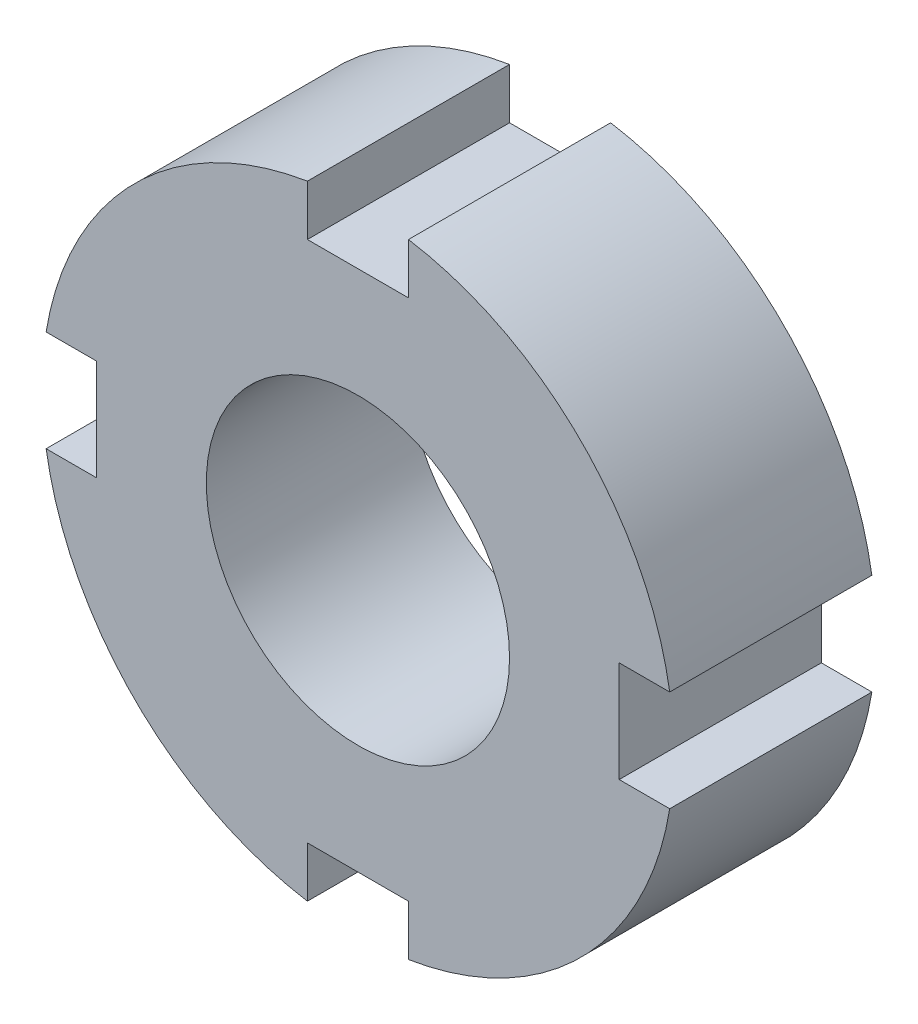
ISO-10303-21;
HEADER;
FILE_DESCRIPTION(('STEP AP214'),'2;1');
FILE_NAME('part.step','',(''),(''),'','','');
FILE_SCHEMA(('AUTOMOTIVE_DESIGN { 1 0 10303 214 1 1 1 1 }'));
ENDSEC;
DATA;
#1=APPLICATION_CONTEXT('core data for automotive mechanical design processes');
#2=APPLICATION_PROTOCOL_DEFINITION('international standard','automotive_design',2000,#1);
#3=PRODUCT_CONTEXT('',#1,'mechanical');
#4=PRODUCT('Part','Part','',(#3));
#5=PRODUCT_RELATED_PRODUCT_CATEGORY('part','',(#4));
#6=PRODUCT_DEFINITION_FORMATION('','',#4);
#7=PRODUCT_DEFINITION_CONTEXT('part definition',#1,'design');
#8=PRODUCT_DEFINITION('design','',#6,#7);
#9=PRODUCT_DEFINITION_SHAPE('','',#8);
#10=(LENGTH_UNIT() NAMED_UNIT(*) SI_UNIT(.MILLI.,.METRE.));
#11=(NAMED_UNIT(*) PLANE_ANGLE_UNIT() SI_UNIT($,.RADIAN.));
#12=(NAMED_UNIT(*) SI_UNIT($,.STERADIAN.) SOLID_ANGLE_UNIT());
#13=UNCERTAINTY_MEASURE_WITH_UNIT(LENGTH_MEASURE(1.E-05),#10,'distance_accuracy_value','');
#14=(GEOMETRIC_REPRESENTATION_CONTEXT(3) GLOBAL_UNCERTAINTY_ASSIGNED_CONTEXT((#13)) GLOBAL_UNIT_ASSIGNED_CONTEXT((#10,
#11,#12)) REPRESENTATION_CONTEXT('',''));
#15=CARTESIAN_POINT('',(0.,0.,0.));
#16=DIRECTION('',(0.,0.,1.));
#17=DIRECTION('',(1.,0.,0.));
#18=AXIS2_PLACEMENT_3D('',#15,#16,#17);
#19=CARTESIAN_POINT('',(0.,2.,8.));
#20=DIRECTION('',(0.,1.,0.));
#21=DIRECTION('',(0.,0.,1.));
#22=AXIS2_PLACEMENT_3D('',#19,#20,#21);
#23=PLANE('',#22);
#24=DIRECTION('',(1.,0.,0.));
#25=VECTOR('',#24,1.);
#26=CARTESIAN_POINT('',(0.,2.,0.));
#27=LINE('',#26,#25);
#28=CARTESIAN_POINT('',(10.3389626792531,2.,0.));
#29=VERTEX_POINT('',#28);
#30=CARTESIAN_POINT('',(12.3389626792531,2.,0.));
#31=VERTEX_POINT('',#30);
#32=EDGE_CURVE('E190',#29,#31,#27,.T.);
#33=ORIENTED_EDGE('',*,*,#32,.T.);
#34=DIRECTION('',(0.,0.,-1.));
#35=VECTOR('',#34,1.);
#36=CARTESIAN_POINT('',(12.3389626792531,2.,8.));
#37=LINE('',#36,#35);
#38=CARTESIAN_POINT('',(12.3389626792531,2.,8.));
#39=VERTEX_POINT('',#38);
#40=EDGE_CURVE('E11',#39,#31,#37,.T.);
#41=ORIENTED_EDGE('',*,*,#40,.F.);
#42=DIRECTION('',(1.,0.,0.));
#43=VECTOR('',#42,1.);
#44=CARTESIAN_POINT('',(0.,2.,8.));
#45=LINE('',#44,#43);
#46=CARTESIAN_POINT('',(10.3389626792531,2.,8.));
#47=VERTEX_POINT('',#46);
#48=EDGE_CURVE('E273',#47,#39,#45,.T.);
#49=ORIENTED_EDGE('',*,*,#48,.F.);
#50=DIRECTION('',(0.,0.,-1.));
#51=VECTOR('',#50,1.);
#52=CARTESIAN_POINT('',(10.3389626792531,2.,8.));
#53=LINE('',#52,#51);
#54=EDGE_CURVE('E56',#47,#29,#53,.T.);
#55=ORIENTED_EDGE('',*,*,#54,.T.);
#56=EDGE_LOOP('',(#33,#41,#49,#55));
#57=FACE_BOUND('',#56,.T.);
#58=ADVANCED_FACE('F39',(#57),#23,.F.);
#59=CARTESIAN_POINT('',(0.,0.,8.));
#60=DIRECTION('',(0.,0.,-1.));
#61=DIRECTION('',(-1.,0.,0.));
#62=AXIS2_PLACEMENT_3D('',#59,#60,#61);
#63=CYLINDRICAL_SURFACE('',#62,12.5);
#64=CARTESIAN_POINT('',(0.,0.,0.));
#65=DIRECTION('',(0.,0.,1.));
#66=DIRECTION('',(1.,0.,0.));
#67=AXIS2_PLACEMENT_3D('',#64,#65,#66);
#68=CIRCLE('',#67,12.5);
#69=CARTESIAN_POINT('',(2.,12.3389626792531,0.));
#70=VERTEX_POINT('',#69);
#71=EDGE_CURVE('E192',#31,#70,#68,.T.);
#72=ORIENTED_EDGE('',*,*,#71,.T.);
#73=DIRECTION('',(0.,0.,-1.));
#74=VECTOR('',#73,1.);
#75=CARTESIAN_POINT('',(2.,12.3389626792531,8.));
#76=LINE('',#75,#74);
#77=CARTESIAN_POINT('',(2.,12.3389626792531,8.));
#78=VERTEX_POINT('',#77);
#79=EDGE_CURVE('E48',#78,#70,#76,.T.);
#80=ORIENTED_EDGE('',*,*,#79,.F.);
#81=CARTESIAN_POINT('',(0.,0.,8.));
#82=DIRECTION('',(0.,0.,1.));
#83=DIRECTION('',(1.,0.,0.));
#84=AXIS2_PLACEMENT_3D('',#81,#82,#83);
#85=CIRCLE('',#84,12.5);
#86=EDGE_CURVE('E118',#39,#78,#85,.T.);
#87=ORIENTED_EDGE('',*,*,#86,.F.);
#88=ORIENTED_EDGE('',*,*,#40,.T.);
#89=EDGE_LOOP('',(#72,#80,#87,#88));
#90=FACE_BOUND('',#89,.T.);
#91=ADVANCED_FACE('F257',(#90),#63,.T.);
#92=CARTESIAN_POINT('',(2.,0.,8.));
#93=DIRECTION('',(-1.,0.,0.));
#94=DIRECTION('',(0.,-1.,0.));
#95=AXIS2_PLACEMENT_3D('',#92,#93,#94);
#96=PLANE('',#95);
#97=DIRECTION('',(0.,1.,0.));
#98=VECTOR('',#97,1.);
#99=CARTESIAN_POINT('',(2.,0.,0.));
#100=LINE('',#99,#98);
#101=CARTESIAN_POINT('',(2.,10.3389626792531,0.));
#102=VERTEX_POINT('',#101);
#103=EDGE_CURVE('E195',#102,#70,#100,.T.);
#104=ORIENTED_EDGE('',*,*,#103,.F.);
#105=DIRECTION('',(0.,0.,-1.));
#106=VECTOR('',#105,1.);
#107=CARTESIAN_POINT('',(2.,10.3389626792531,8.));
#108=LINE('',#107,#106);
#109=CARTESIAN_POINT('',(2.,10.3389626792531,8.));
#110=VERTEX_POINT('',#109);
#111=EDGE_CURVE('E250',#110,#102,#108,.T.);
#112=ORIENTED_EDGE('',*,*,#111,.F.);
#113=DIRECTION('',(0.,1.,0.));
#114=VECTOR('',#113,1.);
#115=CARTESIAN_POINT('',(2.,0.,8.));
#116=LINE('',#115,#114);
#117=EDGE_CURVE('E256',#110,#78,#116,.T.);
#118=ORIENTED_EDGE('',*,*,#117,.T.);
#119=ORIENTED_EDGE('',*,*,#79,.T.);
#120=EDGE_LOOP('',(#104,#112,#118,#119));
#121=FACE_BOUND('',#120,.T.);
#122=ADVANCED_FACE('F254',(#121),#96,.T.);
#123=CARTESIAN_POINT('',(0.,10.3389626792531,8.));
#124=DIRECTION('',(0.,1.,0.));
#125=DIRECTION('',(0.,0.,1.));
#126=AXIS2_PLACEMENT_3D('',#123,#124,#125);
#127=PLANE('',#126);
#128=DIRECTION('',(1.,0.,0.));
#129=VECTOR('',#128,1.);
#130=CARTESIAN_POINT('',(0.,10.3389626792531,0.));
#131=LINE('',#130,#129);
#132=CARTESIAN_POINT('',(-2.,10.3389626792531,0.));
#133=VERTEX_POINT('',#132);
#134=EDGE_CURVE('E199',#133,#102,#131,.T.);
#135=ORIENTED_EDGE('',*,*,#134,.F.);
#136=DIRECTION('',(0.,0.,-1.));
#137=VECTOR('',#136,1.);
#138=CARTESIAN_POINT('',(-2.,10.3389626792531,8.));
#139=LINE('',#138,#137);
#140=CARTESIAN_POINT('',(-2.,10.3389626792531,8.));
#141=VERTEX_POINT('',#140);
#142=EDGE_CURVE('E248',#141,#133,#139,.T.);
#143=ORIENTED_EDGE('',*,*,#142,.F.);
#144=DIRECTION('',(1.,0.,0.));
#145=VECTOR('',#144,1.);
#146=CARTESIAN_POINT('',(0.,10.3389626792531,8.));
#147=LINE('',#146,#145);
#148=EDGE_CURVE('E269',#141,#110,#147,.T.);
#149=ORIENTED_EDGE('',*,*,#148,.T.);
#150=ORIENTED_EDGE('',*,*,#111,.T.);
#151=EDGE_LOOP('',(#135,#143,#149,#150));
#152=FACE_BOUND('',#151,.T.);
#153=ADVANCED_FACE('F265',(#152),#127,.T.);
#154=CARTESIAN_POINT('',(-2.,0.,8.));
#155=DIRECTION('',(-1.,0.,0.));
#156=DIRECTION('',(0.,0.,1.));
#157=AXIS2_PLACEMENT_3D('',#154,#155,#156);
#158=PLANE('',#157);
#159=DIRECTION('',(0.,1.,0.));
#160=VECTOR('',#159,1.);
#161=CARTESIAN_POINT('',(-2.,0.,0.));
#162=LINE('',#161,#160);
#163=CARTESIAN_POINT('',(-2.,12.3389626792531,0.));
#164=VERTEX_POINT('',#163);
#165=EDGE_CURVE('E202',#133,#164,#162,.T.);
#166=ORIENTED_EDGE('',*,*,#165,.T.);
#167=DIRECTION('',(0.,0.,-1.));
#168=VECTOR('',#167,1.);
#169=CARTESIAN_POINT('',(-2.,12.3389626792531,8.));
#170=LINE('',#169,#168);
#171=CARTESIAN_POINT('',(-2.,12.3389626792531,8.));
#172=VERTEX_POINT('',#171);
#173=EDGE_CURVE('E245',#172,#164,#170,.T.);
#174=ORIENTED_EDGE('',*,*,#173,.F.);
#175=DIRECTION('',(0.,1.,0.));
#176=VECTOR('',#175,1.);
#177=CARTESIAN_POINT('',(-2.,0.,8.));
#178=LINE('',#177,#176);
#179=EDGE_CURVE('E271',#141,#172,#178,.T.);
#180=ORIENTED_EDGE('',*,*,#179,.F.);
#181=ORIENTED_EDGE('',*,*,#142,.T.);
#182=EDGE_LOOP('',(#166,#174,#180,#181));
#183=FACE_BOUND('',#182,.T.);
#184=ADVANCED_FACE('F344',(#183),#158,.F.);
#185=CARTESIAN_POINT('',(-12.3389626792531,2.00000000000001,0.));
#186=VERTEX_POINT('',#185);
#187=EDGE_CURVE('E196',#164,#186,#68,.T.);
#188=ORIENTED_EDGE('',*,*,#187,.T.);
#189=DIRECTION('',(0.,0.,-1.));
#190=VECTOR('',#189,1.);
#191=CARTESIAN_POINT('',(-12.3389626792531,2.00000000000001,8.));
#192=LINE('',#191,#190);
#193=CARTESIAN_POINT('',(-12.3389626792531,2.00000000000001,8.));
#194=VERTEX_POINT('',#193);
#195=EDGE_CURVE('E243',#194,#186,#192,.T.);
#196=ORIENTED_EDGE('',*,*,#195,.F.);
#197=EDGE_CURVE('E274',#172,#194,#85,.T.);
#198=ORIENTED_EDGE('',*,*,#197,.F.);
#199=ORIENTED_EDGE('',*,*,#173,.T.);
#200=EDGE_LOOP('',(#188,#196,#198,#199));
#201=FACE_BOUND('',#200,.T.);
#202=ADVANCED_FACE('F304',(#201),#63,.T.);
#203=CARTESIAN_POINT('',(0.,2.00000000000001,8.));
#204=DIRECTION('',(0.,-1.,0.));
#205=DIRECTION('',(0.,0.,-1.));
#206=AXIS2_PLACEMENT_3D('',#203,#204,#205);
#207=PLANE('',#206);
#208=DIRECTION('',(-1.,0.,0.));
#209=VECTOR('',#208,1.);
#210=CARTESIAN_POINT('',(0.,2.00000000000001,0.));
#211=LINE('',#210,#209);
#212=CARTESIAN_POINT('',(-10.3389626792531,2.00000000000001,0.));
#213=VERTEX_POINT('',#212);
#214=EDGE_CURVE('E204',#213,#186,#211,.T.);
#215=ORIENTED_EDGE('',*,*,#214,.F.);
#216=DIRECTION('',(0.,0.,-1.));
#217=VECTOR('',#216,1.);
#218=CARTESIAN_POINT('',(-10.3389626792531,2.00000000000001,8.));
#219=LINE('',#218,#217);
#220=CARTESIAN_POINT('',(-10.3389626792531,2.00000000000001,8.));
#221=VERTEX_POINT('',#220);
#222=EDGE_CURVE('E241',#221,#213,#219,.T.);
#223=ORIENTED_EDGE('',*,*,#222,.F.);
#224=DIRECTION('',(-1.,0.,0.));
#225=VECTOR('',#224,1.);
#226=CARTESIAN_POINT('',(0.,2.00000000000001,8.));
#227=LINE('',#226,#225);
#228=EDGE_CURVE('E278',#221,#194,#227,.T.);
#229=ORIENTED_EDGE('',*,*,#228,.T.);
#230=ORIENTED_EDGE('',*,*,#195,.T.);
#231=EDGE_LOOP('',(#215,#223,#229,#230));
#232=FACE_BOUND('',#231,.T.);
#233=ADVANCED_FACE('F311',(#232),#207,.T.);
#234=CARTESIAN_POINT('',(-10.3389626792531,0.,8.));
#235=DIRECTION('',(1.,0.,0.));
#236=DIRECTION('',(0.,0.,-1.));
#237=AXIS2_PLACEMENT_3D('',#234,#235,#236);
#238=PLANE('',#237);
#239=DIRECTION('',(0.,-1.,0.));
#240=VECTOR('',#239,1.);
#241=CARTESIAN_POINT('',(-10.3389626792531,0.,0.));
#242=LINE('',#241,#240);
#243=CARTESIAN_POINT('',(-10.3389626792531,-1.99999999999999,0.));
#244=VERTEX_POINT('',#243);
#245=EDGE_CURVE('E207',#213,#244,#242,.T.);
#246=ORIENTED_EDGE('',*,*,#245,.T.);
#247=DIRECTION('',(0.,0.,-1.));
#248=VECTOR('',#247,1.);
#249=CARTESIAN_POINT('',(-10.3389626792531,-1.99999999999999,8.));
#250=LINE('',#249,#248);
#251=CARTESIAN_POINT('',(-10.3389626792531,-1.99999999999999,8.));
#252=VERTEX_POINT('',#251);
#253=EDGE_CURVE('E238',#252,#244,#250,.T.);
#254=ORIENTED_EDGE('',*,*,#253,.F.);
#255=DIRECTION('',(0.,-1.,0.));
#256=VECTOR('',#255,1.);
#257=CARTESIAN_POINT('',(-10.3389626792531,0.,8.));
#258=LINE('',#257,#256);
#259=EDGE_CURVE('E281',#221,#252,#258,.T.);
#260=ORIENTED_EDGE('',*,*,#259,.F.);
#261=ORIENTED_EDGE('',*,*,#222,.T.);
#262=EDGE_LOOP('',(#246,#254,#260,#261));
#263=FACE_BOUND('',#262,.T.);
#264=ADVANCED_FACE('F325',(#263),#238,.F.);
#265=CARTESIAN_POINT('',(0.,-1.99999999999999,8.));
#266=DIRECTION('',(0.,-1.,0.));
#267=DIRECTION('',(0.,0.,-1.));
#268=AXIS2_PLACEMENT_3D('',#265,#266,#267);
#269=PLANE('',#268);
#270=DIRECTION('',(-1.,0.,0.));
#271=VECTOR('',#270,1.);
#272=CARTESIAN_POINT('',(0.,-1.99999999999999,0.));
#273=LINE('',#272,#271);
#274=CARTESIAN_POINT('',(-12.3389626792531,-1.99999999999999,0.));
#275=VERTEX_POINT('',#274);
#276=EDGE_CURVE('E209',#244,#275,#273,.T.);
#277=ORIENTED_EDGE('',*,*,#276,.T.);
#278=DIRECTION('',(0.,0.,-1.));
#279=VECTOR('',#278,1.);
#280=CARTESIAN_POINT('',(-12.3389626792531,-1.99999999999999,8.));
#281=LINE('',#280,#279);
#282=CARTESIAN_POINT('',(-12.3389626792531,-1.99999999999999,8.));
#283=VERTEX_POINT('',#282);
#284=EDGE_CURVE('E235',#283,#275,#281,.T.);
#285=ORIENTED_EDGE('',*,*,#284,.F.);
#286=DIRECTION('',(-1.,0.,0.));
#287=VECTOR('',#286,1.);
#288=CARTESIAN_POINT('',(0.,-1.99999999999999,8.));
#289=LINE('',#288,#287);
#290=EDGE_CURVE('E283',#252,#283,#289,.T.);
#291=ORIENTED_EDGE('',*,*,#290,.F.);
#292=ORIENTED_EDGE('',*,*,#253,.T.);
#293=EDGE_LOOP('',(#277,#285,#291,#292));
#294=FACE_BOUND('',#293,.T.);
#295=ADVANCED_FACE('F323',(#294),#269,.F.);
#296=CARTESIAN_POINT('',(-2.,-12.3389626792531,0.));
#297=VERTEX_POINT('',#296);
#298=EDGE_CURVE('E211',#275,#297,#68,.T.);
#299=ORIENTED_EDGE('',*,*,#298,.T.);
#300=DIRECTION('',(0.,0.,-1.));
#301=VECTOR('',#300,1.);
#302=CARTESIAN_POINT('',(-2.,-12.3389626792531,8.));
#303=LINE('',#302,#301);
#304=CARTESIAN_POINT('',(-2.,-12.3389626792531,8.));
#305=VERTEX_POINT('',#304);
#306=EDGE_CURVE('E233',#305,#297,#303,.T.);
#307=ORIENTED_EDGE('',*,*,#306,.F.);
#308=EDGE_CURVE('E170',#283,#305,#85,.T.);
#309=ORIENTED_EDGE('',*,*,#308,.F.);
#310=ORIENTED_EDGE('',*,*,#284,.T.);
#311=EDGE_LOOP('',(#299,#307,#309,#310));
#312=FACE_BOUND('',#311,.T.);
#313=ADVANCED_FACE('F318',(#312),#63,.T.);
#314=CARTESIAN_POINT('',(-2.,0.,8.));
#315=DIRECTION('',(1.,0.,0.));
#316=DIRECTION('',(0.,0.,-1.));
#317=AXIS2_PLACEMENT_3D('',#314,#315,#316);
#318=PLANE('',#317);
#319=DIRECTION('',(0.,-1.,0.));
#320=VECTOR('',#319,1.);
#321=CARTESIAN_POINT('',(-2.,0.,0.));
#322=LINE('',#321,#320);
#323=CARTESIAN_POINT('',(-2.,-10.3389626792531,0.));
#324=VERTEX_POINT('',#323);
#325=EDGE_CURVE('E212',#324,#297,#322,.T.);
#326=ORIENTED_EDGE('',*,*,#325,.F.);
#327=DIRECTION('',(0.,0.,-1.));
#328=VECTOR('',#327,1.);
#329=CARTESIAN_POINT('',(-2.,-10.3389626792531,8.));
#330=LINE('',#329,#328);
#331=CARTESIAN_POINT('',(-2.,-10.3389626792531,8.));
#332=VERTEX_POINT('',#331);
#333=EDGE_CURVE('E231',#332,#324,#330,.T.);
#334=ORIENTED_EDGE('',*,*,#333,.F.);
#335=DIRECTION('',(0.,-1.,0.));
#336=VECTOR('',#335,1.);
#337=CARTESIAN_POINT('',(-2.,0.,8.));
#338=LINE('',#337,#336);
#339=EDGE_CURVE('E285',#332,#305,#338,.T.);
#340=ORIENTED_EDGE('',*,*,#339,.T.);
#341=ORIENTED_EDGE('',*,*,#306,.T.);
#342=EDGE_LOOP('',(#326,#334,#340,#341));
#343=FACE_BOUND('',#342,.T.);
#344=ADVANCED_FACE('F321',(#343),#318,.T.);
#345=CARTESIAN_POINT('',(0.,-10.3389626792531,8.));
#346=DIRECTION('',(0.,1.,0.));
#347=DIRECTION('',(0.,0.,1.));
#348=AXIS2_PLACEMENT_3D('',#345,#346,#347);
#349=PLANE('',#348);
#350=DIRECTION('',(1.,0.,0.));
#351=VECTOR('',#350,1.);
#352=CARTESIAN_POINT('',(0.,-10.3389626792531,0.));
#353=LINE('',#352,#351);
#354=CARTESIAN_POINT('',(2.,-10.3389626792531,0.));
#355=VERTEX_POINT('',#354);
#356=EDGE_CURVE('E215',#324,#355,#353,.T.);
#357=ORIENTED_EDGE('',*,*,#356,.T.);
#358=DIRECTION('',(0.,0.,-1.));
#359=VECTOR('',#358,1.);
#360=CARTESIAN_POINT('',(2.,-10.3389626792531,8.));
#361=LINE('',#360,#359);
#362=CARTESIAN_POINT('',(2.,-10.3389626792531,8.));
#363=VERTEX_POINT('',#362);
#364=EDGE_CURVE('E228',#363,#355,#361,.T.);
#365=ORIENTED_EDGE('',*,*,#364,.F.);
#366=DIRECTION('',(1.,0.,0.));
#367=VECTOR('',#366,1.);
#368=CARTESIAN_POINT('',(0.,-10.3389626792531,8.));
#369=LINE('',#368,#367);
#370=EDGE_CURVE('E287',#332,#363,#369,.T.);
#371=ORIENTED_EDGE('',*,*,#370,.F.);
#372=ORIENTED_EDGE('',*,*,#333,.T.);
#373=EDGE_LOOP('',(#357,#365,#371,#372));
#374=FACE_BOUND('',#373,.T.);
#375=ADVANCED_FACE('F292',(#374),#349,.F.);
#376=CARTESIAN_POINT('',(2.,0.,8.));
#377=DIRECTION('',(1.,0.,0.));
#378=DIRECTION('',(0.,1.,0.));
#379=AXIS2_PLACEMENT_3D('',#376,#377,#378);
#380=PLANE('',#379);
#381=DIRECTION('',(0.,-1.,0.));
#382=VECTOR('',#381,1.);
#383=CARTESIAN_POINT('',(2.,0.,0.));
#384=LINE('',#383,#382);
#385=CARTESIAN_POINT('',(2.,-12.3389626792531,0.));
#386=VERTEX_POINT('',#385);
#387=EDGE_CURVE('E217',#355,#386,#384,.T.);
#388=ORIENTED_EDGE('',*,*,#387,.T.);
#389=DIRECTION('',(0.,0.,-1.));
#390=VECTOR('',#389,1.);
#391=CARTESIAN_POINT('',(2.,-12.3389626792531,8.));
#392=LINE('',#391,#390);
#393=CARTESIAN_POINT('',(2.,-12.3389626792531,8.));
#394=VERTEX_POINT('',#393);
#395=EDGE_CURVE('E178',#394,#386,#392,.T.);
#396=ORIENTED_EDGE('',*,*,#395,.F.);
#397=DIRECTION('',(0.,-1.,0.));
#398=VECTOR('',#397,1.);
#399=CARTESIAN_POINT('',(2.,0.,8.));
#400=LINE('',#399,#398);
#401=EDGE_CURVE('E165',#363,#394,#400,.T.);
#402=ORIENTED_EDGE('',*,*,#401,.F.);
#403=ORIENTED_EDGE('',*,*,#364,.T.);
#404=EDGE_LOOP('',(#388,#396,#402,#403));
#405=FACE_BOUND('',#404,.T.);
#406=ADVANCED_FACE('F296',(#405),#380,.F.);
#407=CARTESIAN_POINT('',(12.3389626792531,-2.,0.));
#408=VERTEX_POINT('',#407);
#409=EDGE_CURVE('E175',#386,#408,#68,.T.);
#410=ORIENTED_EDGE('',*,*,#409,.T.);
#411=DIRECTION('',(0.,0.,-1.));
#412=VECTOR('',#411,1.);
#413=CARTESIAN_POINT('',(12.3389626792531,-2.,8.));
#414=LINE('',#413,#412);
#415=CARTESIAN_POINT('',(12.3389626792531,-2.,8.));
#416=VERTEX_POINT('',#415);
#417=EDGE_CURVE('E172',#416,#408,#414,.T.);
#418=ORIENTED_EDGE('',*,*,#417,.F.);
#419=EDGE_CURVE('E158',#394,#416,#85,.T.);
#420=ORIENTED_EDGE('',*,*,#419,.F.);
#421=ORIENTED_EDGE('',*,*,#395,.T.);
#422=EDGE_LOOP('',(#410,#418,#420,#421));
#423=FACE_BOUND('',#422,.T.);
#424=ADVANCED_FACE('F173',(#423),#63,.T.);
#425=CARTESIAN_POINT('',(0.,-2.,8.));
#426=DIRECTION('',(0.,1.,0.));
#427=DIRECTION('',(0.,0.,1.));
#428=AXIS2_PLACEMENT_3D('',#425,#426,#427);
#429=PLANE('',#428);
#430=DIRECTION('',(1.,0.,0.));
#431=VECTOR('',#430,1.);
#432=CARTESIAN_POINT('',(0.,-2.,0.));
#433=LINE('',#432,#431);
#434=CARTESIAN_POINT('',(10.3389626792531,-2.,0.));
#435=VERTEX_POINT('',#434);
#436=EDGE_CURVE('E219',#435,#408,#433,.T.);
#437=ORIENTED_EDGE('',*,*,#436,.F.);
#438=DIRECTION('',(0.,0.,-1.));
#439=VECTOR('',#438,1.);
#440=CARTESIAN_POINT('',(10.3389626792531,-2.,8.));
#441=LINE('',#440,#439);
#442=CARTESIAN_POINT('',(10.3389626792531,-2.,8.));
#443=VERTEX_POINT('',#442);
#444=EDGE_CURVE('E106',#443,#435,#441,.T.);
#445=ORIENTED_EDGE('',*,*,#444,.F.);
#446=DIRECTION('',(1.,0.,0.));
#447=VECTOR('',#446,1.);
#448=CARTESIAN_POINT('',(0.,-2.,8.));
#449=LINE('',#448,#447);
#450=EDGE_CURVE('E163',#443,#416,#449,.T.);
#451=ORIENTED_EDGE('',*,*,#450,.T.);
#452=ORIENTED_EDGE('',*,*,#417,.T.);
#453=EDGE_LOOP('',(#437,#445,#451,#452));
#454=FACE_BOUND('',#453,.T.);
#455=ADVANCED_FACE('F180',(#454),#429,.T.);
#456=CARTESIAN_POINT('',(0.,0.,8.));
#457=DIRECTION('',(0.,0.,-1.));
#458=DIRECTION('',(-1.,0.,0.));
#459=AXIS2_PLACEMENT_3D('',#456,#457,#458);
#460=CYLINDRICAL_SURFACE('',#459,6.);
#461=CARTESIAN_POINT('',(0.,0.,8.));
#462=DIRECTION('',(0.,0.,1.));
#463=DIRECTION('',(1.,0.,0.));
#464=AXIS2_PLACEMENT_3D('',#461,#462,#463);
#465=CIRCLE('',#464,6.);
#466=CARTESIAN_POINT('',(6.,0.,8.));
#467=VERTEX_POINT('',#466);
#468=EDGE_CURVE('E224',#467,#467,#465,.T.);
#469=ORIENTED_EDGE('',*,*,#468,.T.);
#470=EDGE_LOOP('',(#469));
#471=FACE_BOUND('',#470,.T.);
#472=CARTESIAN_POINT('',(0.,0.,0.));
#473=DIRECTION('',(0.,0.,1.));
#474=DIRECTION('',(1.,0.,0.));
#475=AXIS2_PLACEMENT_3D('',#472,#473,#474);
#476=CIRCLE('',#475,6.);
#477=CARTESIAN_POINT('',(6.,0.,0.));
#478=VERTEX_POINT('',#477);
#479=EDGE_CURVE('E187',#478,#478,#476,.T.);
#480=ORIENTED_EDGE('',*,*,#479,.F.);
#481=EDGE_LOOP('',(#480));
#482=FACE_BOUND('',#481,.T.);
#483=ADVANCED_FACE('F41',(#471,#482),#460,.F.);
#484=CARTESIAN_POINT('',(10.3389626792531,0.,8.));
#485=DIRECTION('',(1.,0.,0.));
#486=DIRECTION('',(0.,0.,-1.));
#487=AXIS2_PLACEMENT_3D('',#484,#485,#486);
#488=PLANE('',#487);
#489=DIRECTION('',(0.,-1.,0.));
#490=VECTOR('',#489,1.);
#491=CARTESIAN_POINT('',(10.3389626792531,0.,0.));
#492=LINE('',#491,#490);
#493=EDGE_CURVE('E221',#29,#435,#492,.T.);
#494=ORIENTED_EDGE('',*,*,#493,.F.);
#495=ORIENTED_EDGE('',*,*,#54,.F.);
#496=DIRECTION('',(0.,-1.,0.));
#497=VECTOR('',#496,1.);
#498=CARTESIAN_POINT('',(10.3389626792531,0.,8.));
#499=LINE('',#498,#497);
#500=EDGE_CURVE('E181',#47,#443,#499,.T.);
#501=ORIENTED_EDGE('',*,*,#500,.T.);
#502=ORIENTED_EDGE('',*,*,#444,.T.);
#503=EDGE_LOOP('',(#494,#495,#501,#502));
#504=FACE_BOUND('',#503,.T.);
#505=ADVANCED_FACE('F449',(#504),#488,.T.);
#506=CARTESIAN_POINT('',(0.,0.,8.));
#507=DIRECTION('',(0.,0.,1.));
#508=DIRECTION('',(1.,0.,0.));
#509=AXIS2_PLACEMENT_3D('',#506,#507,#508);
#510=PLANE('',#509);
#511=ORIENTED_EDGE('',*,*,#468,.F.);
#512=EDGE_LOOP('',(#511));
#513=FACE_BOUND('',#512,.T.);
#514=ORIENTED_EDGE('',*,*,#48,.T.);
#515=ORIENTED_EDGE('',*,*,#86,.T.);
#516=ORIENTED_EDGE('',*,*,#117,.F.);
#517=ORIENTED_EDGE('',*,*,#148,.F.);
#518=ORIENTED_EDGE('',*,*,#179,.T.);
#519=ORIENTED_EDGE('',*,*,#197,.T.);
#520=ORIENTED_EDGE('',*,*,#228,.F.);
#521=ORIENTED_EDGE('',*,*,#259,.T.);
#522=ORIENTED_EDGE('',*,*,#290,.T.);
#523=ORIENTED_EDGE('',*,*,#308,.T.);
#524=ORIENTED_EDGE('',*,*,#339,.F.);
#525=ORIENTED_EDGE('',*,*,#370,.T.);
#526=ORIENTED_EDGE('',*,*,#401,.T.);
#527=ORIENTED_EDGE('',*,*,#419,.T.);
#528=ORIENTED_EDGE('',*,*,#450,.F.);
#529=ORIENTED_EDGE('',*,*,#500,.F.);
#530=EDGE_LOOP('',(#514,#515,#516,#517,#518,#519,#520,#521,#522,#523,#524,#525,#526,#527,#528,#529));
#531=FACE_BOUND('',#530,.T.);
#532=ADVANCED_FACE('F160',(#513,#531),#510,.T.);
#533=CARTESIAN_POINT('',(0.,0.,0.));
#534=DIRECTION('',(0.,0.,1.));
#535=DIRECTION('',(1.,0.,0.));
#536=AXIS2_PLACEMENT_3D('',#533,#534,#535);
#537=PLANE('',#536);
#538=ORIENTED_EDGE('',*,*,#479,.T.);
#539=EDGE_LOOP('',(#538));
#540=FACE_BOUND('',#539,.T.);
#541=ORIENTED_EDGE('',*,*,#32,.F.);
#542=ORIENTED_EDGE('',*,*,#493,.T.);
#543=ORIENTED_EDGE('',*,*,#436,.T.);
#544=ORIENTED_EDGE('',*,*,#409,.F.);
#545=ORIENTED_EDGE('',*,*,#387,.F.);
#546=ORIENTED_EDGE('',*,*,#356,.F.);
#547=ORIENTED_EDGE('',*,*,#325,.T.);
#548=ORIENTED_EDGE('',*,*,#298,.F.);
#549=ORIENTED_EDGE('',*,*,#276,.F.);
#550=ORIENTED_EDGE('',*,*,#245,.F.);
#551=ORIENTED_EDGE('',*,*,#214,.T.);
#552=ORIENTED_EDGE('',*,*,#187,.F.);
#553=ORIENTED_EDGE('',*,*,#165,.F.);
#554=ORIENTED_EDGE('',*,*,#134,.T.);
#555=ORIENTED_EDGE('',*,*,#103,.T.);
#556=ORIENTED_EDGE('',*,*,#71,.F.);
#557=EDGE_LOOP('',(#541,#542,#543,#544,#545,#546,#547,#548,#549,#550,#551,#552,#553,#554,#555,#556));
#558=FACE_BOUND('',#557,.T.);
#559=ADVANCED_FACE('F260',(#540,#558),#537,.F.);
#560=CLOSED_SHELL('',(#58,#91,#122,#153,#184,#202,#233,#264,#295,#313,#344,#375,#406,#424,#455,
#483,#505,#532,#559));
#561=MANIFOLD_SOLID_BREP('B2',#560);
#562=ADVANCED_BREP_SHAPE_REPRESENTATION('',(#18,#561),#14);
#563=SHAPE_DEFINITION_REPRESENTATION(#9,#562);
ENDSEC;
END-ISO-10303-21;
